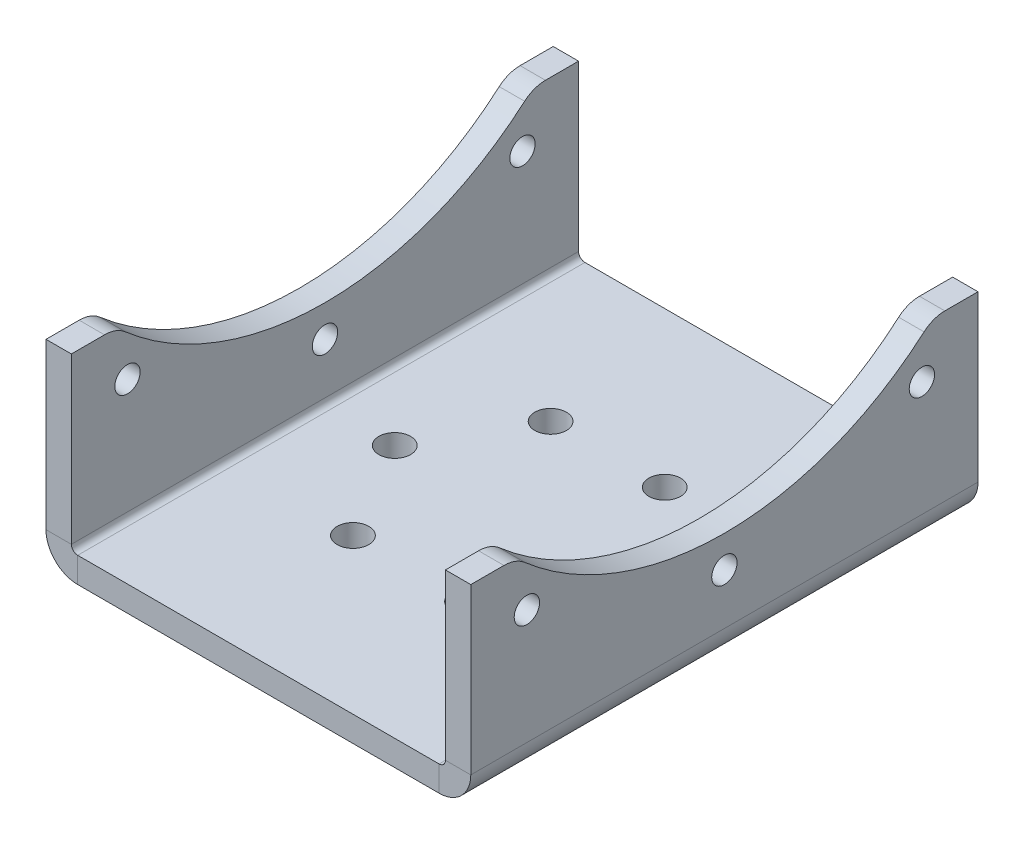
ISO-10303-21;
HEADER;
FILE_DESCRIPTION(('STEP AP214'),'2;1');
FILE_NAME('part.step','',(''),(''),'','','');
FILE_SCHEMA(('AUTOMOTIVE_DESIGN { 1 0 10303 214 1 1 1 1 }'));
ENDSEC;
DATA;
#1=APPLICATION_CONTEXT('core data for automotive mechanical design processes');
#2=APPLICATION_PROTOCOL_DEFINITION('international standard','automotive_design',2000,#1);
#3=PRODUCT_CONTEXT('',#1,'mechanical');
#4=PRODUCT('Part','Part','',(#3));
#5=PRODUCT_RELATED_PRODUCT_CATEGORY('part','',(#4));
#6=PRODUCT_DEFINITION_FORMATION('','',#4);
#7=PRODUCT_DEFINITION_CONTEXT('part definition',#1,'design');
#8=PRODUCT_DEFINITION('design','',#6,#7);
#9=PRODUCT_DEFINITION_SHAPE('','',#8);
#10=(LENGTH_UNIT() NAMED_UNIT(*) SI_UNIT(.MILLI.,.METRE.));
#11=(NAMED_UNIT(*) PLANE_ANGLE_UNIT() SI_UNIT($,.RADIAN.));
#12=(NAMED_UNIT(*) SI_UNIT($,.STERADIAN.) SOLID_ANGLE_UNIT());
#13=UNCERTAINTY_MEASURE_WITH_UNIT(LENGTH_MEASURE(1.E-05),#10,'distance_accuracy_value','');
#14=(GEOMETRIC_REPRESENTATION_CONTEXT(3) GLOBAL_UNCERTAINTY_ASSIGNED_CONTEXT((#13)) GLOBAL_UNIT_ASSIGNED_CONTEXT((#10,
#11,#12)) REPRESENTATION_CONTEXT('',''));
#15=CARTESIAN_POINT('',(0.,0.,0.));
#16=DIRECTION('',(0.,0.,1.));
#17=DIRECTION('',(1.,0.,0.));
#18=AXIS2_PLACEMENT_3D('',#15,#16,#17);
#19=CARTESIAN_POINT('',(-33.5,27.,80.));
#20=DIRECTION('',(0.,1.,0.));
#21=DIRECTION('',(0.,0.,1.));
#22=AXIS2_PLACEMENT_3D('',#19,#20,#21);
#23=PLANE('',#22);
#24=DIRECTION('',(0.,0.,-1.));
#25=VECTOR('',#24,1.);
#26=CARTESIAN_POINT('',(-33.5,27.,80.));
#27=LINE('',#26,#25);
#28=CARTESIAN_POINT('',(-33.5,27.,5.22932269857251));
#29=VERTEX_POINT('',#28);
#30=CARTESIAN_POINT('',(-33.5,27.,0.));
#31=VERTEX_POINT('',#30);
#32=EDGE_CURVE('E298',#29,#31,#27,.T.);
#33=ORIENTED_EDGE('',*,*,#32,.F.);
#34=DIRECTION('',(1.,0.,0.));
#35=VECTOR('',#34,1.);
#36=CARTESIAN_POINT('',(-29.5,27.,5.22932269857251));
#37=LINE('',#36,#35);
#38=CARTESIAN_POINT('',(-29.5,27.,5.22932269857251));
#39=VERTEX_POINT('',#38);
#40=EDGE_CURVE('E344',#29,#39,#37,.T.);
#41=ORIENTED_EDGE('',*,*,#40,.T.);
#42=DIRECTION('',(0.,0.,-1.));
#43=VECTOR('',#42,1.);
#44=CARTESIAN_POINT('',(-29.5,27.,80.));
#45=LINE('',#44,#43);
#46=CARTESIAN_POINT('',(-29.5,27.,0.));
#47=VERTEX_POINT('',#46);
#48=EDGE_CURVE('E196',#39,#47,#45,.T.);
#49=ORIENTED_EDGE('',*,*,#48,.T.);
#50=DIRECTION('',(1.,0.,0.));
#51=VECTOR('',#50,1.);
#52=CARTESIAN_POINT('',(-33.5,27.,0.));
#53=LINE('',#52,#51);
#54=EDGE_CURVE('E236',#31,#47,#53,.T.);
#55=ORIENTED_EDGE('',*,*,#54,.F.);
#56=EDGE_LOOP('',(#33,#41,#49,#55));
#57=FACE_BOUND('',#56,.T.);
#58=ADVANCED_FACE('F36',(#57),#23,.T.);
#59=CARTESIAN_POINT('',(29.5,27.,80.));
#60=DIRECTION('',(0.,1.,0.));
#61=DIRECTION('',(0.,0.,1.));
#62=AXIS2_PLACEMENT_3D('',#59,#60,#61);
#63=PLANE('',#62);
#64=DIRECTION('',(0.,0.,-1.));
#65=VECTOR('',#64,1.);
#66=CARTESIAN_POINT('',(29.5,27.,80.));
#67=LINE('',#66,#65);
#68=CARTESIAN_POINT('',(29.5,27.,5.22932269857251));
#69=VERTEX_POINT('',#68);
#70=CARTESIAN_POINT('',(29.5,27.,0.));
#71=VERTEX_POINT('',#70);
#72=EDGE_CURVE('E279',#69,#71,#67,.T.);
#73=ORIENTED_EDGE('',*,*,#72,.F.);
#74=DIRECTION('',(1.,0.,0.));
#75=VECTOR('',#74,1.);
#76=CARTESIAN_POINT('',(33.5,27.,5.22932269857251));
#77=LINE('',#76,#75);
#78=CARTESIAN_POINT('',(33.5,27.,5.22932269857251));
#79=VERTEX_POINT('',#78);
#80=EDGE_CURVE('E61',#69,#79,#77,.T.);
#81=ORIENTED_EDGE('',*,*,#80,.T.);
#82=DIRECTION('',(0.,0.,-1.));
#83=VECTOR('',#82,1.);
#84=CARTESIAN_POINT('',(33.5,27.,80.));
#85=LINE('',#84,#83);
#86=CARTESIAN_POINT('',(33.5,27.,0.));
#87=VERTEX_POINT('',#86);
#88=EDGE_CURVE('E283',#79,#87,#85,.T.);
#89=ORIENTED_EDGE('',*,*,#88,.T.);
#90=DIRECTION('',(1.,0.,0.));
#91=VECTOR('',#90,1.);
#92=CARTESIAN_POINT('',(29.5,27.,0.));
#93=LINE('',#92,#91);
#94=EDGE_CURVE('E255',#71,#87,#93,.T.);
#95=ORIENTED_EDGE('',*,*,#94,.F.);
#96=EDGE_LOOP('',(#73,#81,#89,#95));
#97=FACE_BOUND('',#96,.T.);
#98=ADVANCED_FACE('F426',(#97),#63,.T.);
#99=CARTESIAN_POINT('',(29.5,1.00000000000001,80.));
#100=DIRECTION('',(0.,0.,1.));
#101=DIRECTION('',(1.,0.,0.));
#102=AXIS2_PLACEMENT_3D('',#99,#100,#101);
#103=PLANE('',#102);
#104=DIRECTION('',(1.,0.,0.));
#105=VECTOR('',#104,1.);
#106=CARTESIAN_POINT('',(29.5,1.00000000000001,80.));
#107=LINE('',#106,#105);
#108=CARTESIAN_POINT('',(29.5,1.00000000000001,80.));
#109=VERTEX_POINT('',#108);
#110=CARTESIAN_POINT('',(33.5,1.00000000000001,80.));
#111=VERTEX_POINT('',#110);
#112=EDGE_CURVE('E312',#109,#111,#107,.T.);
#113=ORIENTED_EDGE('',*,*,#112,.F.);
#114=CARTESIAN_POINT('',(28.5,1.00000000000001,80.));
#115=DIRECTION('',(0.,0.,1.));
#116=DIRECTION('',(1.,0.,0.));
#117=AXIS2_PLACEMENT_3D('',#114,#115,#116);
#118=CIRCLE('',#117,1.);
#119=CARTESIAN_POINT('',(28.5,0.,80.));
#120=VERTEX_POINT('',#119);
#121=EDGE_CURVE('E224',#109,#120,#118,.F.);
#122=ORIENTED_EDGE('',*,*,#121,.T.);
#123=DIRECTION('',(0.,1.,0.));
#124=VECTOR('',#123,1.);
#125=CARTESIAN_POINT('',(28.5,-3.99999999999999,80.));
#126=LINE('',#125,#124);
#127=CARTESIAN_POINT('',(28.5,-3.99999999999999,80.));
#128=VERTEX_POINT('',#127);
#129=EDGE_CURVE('E310',#128,#120,#126,.T.);
#130=ORIENTED_EDGE('',*,*,#129,.F.);
#131=CARTESIAN_POINT('',(28.5,1.00000000000001,80.));
#132=DIRECTION('',(0.,0.,1.));
#133=DIRECTION('',(1.,0.,0.));
#134=AXIS2_PLACEMENT_3D('',#131,#132,#133);
#135=CIRCLE('',#134,5.);
#136=EDGE_CURVE('E212',#111,#128,#135,.F.);
#137=ORIENTED_EDGE('',*,*,#136,.F.);
#138=EDGE_LOOP('',(#113,#122,#130,#137));
#139=FACE_BOUND('',#138,.T.);
#140=ADVANCED_FACE('F432',(#139),#103,.T.);
#141=CARTESIAN_POINT('',(28.5,-3.99999999999999,80.));
#142=DIRECTION('',(0.,0.,1.));
#143=DIRECTION('',(1.,0.,0.));
#144=AXIS2_PLACEMENT_3D('',#141,#142,#143);
#145=PLANE('',#144);
#146=DIRECTION('',(0.,-1.,0.));
#147=VECTOR('',#146,1.);
#148=CARTESIAN_POINT('',(29.5,0.,80.));
#149=LINE('',#148,#147);
#150=CARTESIAN_POINT('',(29.5,27.,80.));
#151=VERTEX_POINT('',#150);
#152=EDGE_CURVE('E221',#151,#109,#149,.T.);
#153=ORIENTED_EDGE('',*,*,#152,.T.);
#154=ORIENTED_EDGE('',*,*,#112,.T.);
#155=DIRECTION('',(0.,1.,0.));
#156=VECTOR('',#155,1.);
#157=CARTESIAN_POINT('',(33.5,0.,80.));
#158=LINE('',#157,#156);
#159=CARTESIAN_POINT('',(33.5,27.,80.));
#160=VERTEX_POINT('',#159);
#161=EDGE_CURVE('E215',#160,#111,#158,.F.);
#162=ORIENTED_EDGE('',*,*,#161,.F.);
#163=DIRECTION('',(1.,0.,0.));
#164=VECTOR('',#163,1.);
#165=CARTESIAN_POINT('',(29.5,27.,80.));
#166=LINE('',#165,#164);
#167=EDGE_CURVE('E218',#151,#160,#166,.T.);
#168=ORIENTED_EDGE('',*,*,#167,.F.);
#169=EDGE_LOOP('',(#153,#154,#162,#168));
#170=FACE_BOUND('',#169,.T.);
#171=ADVANCED_FACE('F472',(#170),#145,.T.);
#172=CARTESIAN_POINT('',(28.5,0.,0.));
#173=DIRECTION('',(0.,0.,-1.));
#174=DIRECTION('',(-1.,0.,0.));
#175=AXIS2_PLACEMENT_3D('',#172,#173,#174);
#176=PLANE('',#175);
#177=DIRECTION('',(0.,-1.,0.));
#178=VECTOR('',#177,1.);
#179=CARTESIAN_POINT('',(28.5,0.,0.));
#180=LINE('',#179,#178);
#181=CARTESIAN_POINT('',(28.5,0.,0.));
#182=VERTEX_POINT('',#181);
#183=CARTESIAN_POINT('',(28.5,-3.99999999999999,0.));
#184=VERTEX_POINT('',#183);
#185=EDGE_CURVE('E308',#182,#184,#180,.T.);
#186=ORIENTED_EDGE('',*,*,#185,.F.);
#187=CARTESIAN_POINT('',(28.5,1.00000000000001,0.));
#188=DIRECTION('',(0.,0.,1.));
#189=DIRECTION('',(1.,0.,0.));
#190=AXIS2_PLACEMENT_3D('',#187,#188,#189);
#191=CIRCLE('',#190,1.);
#192=CARTESIAN_POINT('',(29.5,1.00000000000001,0.));
#193=VERTEX_POINT('',#192);
#194=EDGE_CURVE('E261',#193,#182,#191,.F.);
#195=ORIENTED_EDGE('',*,*,#194,.F.);
#196=DIRECTION('',(-1.,0.,0.));
#197=VECTOR('',#196,1.);
#198=CARTESIAN_POINT('',(33.5,1.00000000000001,0.));
#199=LINE('',#198,#197);
#200=CARTESIAN_POINT('',(33.5,1.00000000000001,0.));
#201=VERTEX_POINT('',#200);
#202=EDGE_CURVE('E306',#201,#193,#199,.T.);
#203=ORIENTED_EDGE('',*,*,#202,.F.);
#204=CARTESIAN_POINT('',(28.5,1.00000000000001,0.));
#205=DIRECTION('',(0.,0.,1.));
#206=DIRECTION('',(1.,0.,0.));
#207=AXIS2_PLACEMENT_3D('',#204,#205,#206);
#208=CIRCLE('',#207,5.);
#209=EDGE_CURVE('E249',#201,#184,#208,.F.);
#210=ORIENTED_EDGE('',*,*,#209,.T.);
#211=EDGE_LOOP('',(#186,#195,#203,#210));
#212=FACE_BOUND('',#211,.T.);
#213=ADVANCED_FACE('F468',(#212),#176,.T.);
#214=CARTESIAN_POINT('',(33.5,1.00000000000001,0.));
#215=DIRECTION('',(0.,0.,-1.));
#216=DIRECTION('',(-1.,0.,0.));
#217=AXIS2_PLACEMENT_3D('',#214,#215,#216);
#218=PLANE('',#217);
#219=DIRECTION('',(-1.,0.,0.));
#220=VECTOR('',#219,1.);
#221=CARTESIAN_POINT('',(-29.5,0.,0.));
#222=LINE('',#221,#220);
#223=CARTESIAN_POINT('',(-28.5,0.,0.));
#224=VERTEX_POINT('',#223);
#225=EDGE_CURVE('E264',#182,#224,#222,.T.);
#226=ORIENTED_EDGE('',*,*,#225,.F.);
#227=ORIENTED_EDGE('',*,*,#185,.T.);
#228=DIRECTION('',(-1.,0.,0.));
#229=VECTOR('',#228,1.);
#230=CARTESIAN_POINT('',(-29.5,-4.,0.));
#231=LINE('',#230,#229);
#232=CARTESIAN_POINT('',(-28.5,-4.,0.));
#233=VERTEX_POINT('',#232);
#234=EDGE_CURVE('E246',#184,#233,#231,.T.);
#235=ORIENTED_EDGE('',*,*,#234,.T.);
#236=DIRECTION('',(0.,1.,0.));
#237=VECTOR('',#236,1.);
#238=CARTESIAN_POINT('',(-28.5,-4.,0.));
#239=LINE('',#238,#237);
#240=EDGE_CURVE('E195',#233,#224,#239,.T.);
#241=ORIENTED_EDGE('',*,*,#240,.T.);
#242=EDGE_LOOP('',(#226,#227,#235,#241));
#243=FACE_BOUND('',#242,.T.);
#244=ADVANCED_FACE('F464',(#243),#218,.T.);
#245=CARTESIAN_POINT('',(-28.5,0.,80.));
#246=DIRECTION('',(0.,0.,1.));
#247=DIRECTION('',(1.,0.,0.));
#248=AXIS2_PLACEMENT_3D('',#245,#246,#247);
#249=PLANE('',#248);
#250=DIRECTION('',(0.,-1.,0.));
#251=VECTOR('',#250,1.);
#252=CARTESIAN_POINT('',(-28.5,0.,80.));
#253=LINE('',#252,#251);
#254=CARTESIAN_POINT('',(-28.5,0.,80.));
#255=VERTEX_POINT('',#254);
#256=CARTESIAN_POINT('',(-28.5,-4.,80.));
#257=VERTEX_POINT('',#256);
#258=EDGE_CURVE('E304',#255,#257,#253,.T.);
#259=ORIENTED_EDGE('',*,*,#258,.F.);
#260=CARTESIAN_POINT('',(-28.5,1.,80.));
#261=DIRECTION('',(0.,0.,1.));
#262=DIRECTION('',(1.,0.,0.));
#263=AXIS2_PLACEMENT_3D('',#260,#261,#262);
#264=CIRCLE('',#263,1.);
#265=CARTESIAN_POINT('',(-29.5,1.,80.));
#266=VERTEX_POINT('',#265);
#267=EDGE_CURVE('E230',#255,#266,#264,.F.);
#268=ORIENTED_EDGE('',*,*,#267,.T.);
#269=DIRECTION('',(1.,0.,0.));
#270=VECTOR('',#269,1.);
#271=CARTESIAN_POINT('',(-33.5,1.,80.));
#272=LINE('',#271,#270);
#273=CARTESIAN_POINT('',(-33.5,1.,80.));
#274=VERTEX_POINT('',#273);
#275=EDGE_CURVE('E182',#274,#266,#272,.T.);
#276=ORIENTED_EDGE('',*,*,#275,.F.);
#277=CARTESIAN_POINT('',(-28.5,1.,80.));
#278=DIRECTION('',(0.,0.,1.));
#279=DIRECTION('',(1.,0.,0.));
#280=AXIS2_PLACEMENT_3D('',#277,#278,#279);
#281=CIRCLE('',#280,5.);
#282=EDGE_CURVE('E203',#257,#274,#281,.F.);
#283=ORIENTED_EDGE('',*,*,#282,.F.);
#284=EDGE_LOOP('',(#259,#268,#276,#283));
#285=FACE_BOUND('',#284,.T.);
#286=ADVANCED_FACE('F460',(#285),#249,.T.);
#287=CARTESIAN_POINT('',(-33.5,1.,80.));
#288=DIRECTION('',(0.,0.,1.));
#289=DIRECTION('',(1.,0.,0.));
#290=AXIS2_PLACEMENT_3D('',#287,#288,#289);
#291=PLANE('',#290);
#292=DIRECTION('',(-1.,0.,0.));
#293=VECTOR('',#292,1.);
#294=CARTESIAN_POINT('',(-29.5,0.,80.));
#295=LINE('',#294,#293);
#296=EDGE_CURVE('E227',#120,#255,#295,.T.);
#297=ORIENTED_EDGE('',*,*,#296,.T.);
#298=ORIENTED_EDGE('',*,*,#258,.T.);
#299=DIRECTION('',(-1.,0.,0.));
#300=VECTOR('',#299,1.);
#301=CARTESIAN_POINT('',(-29.5,-4.,80.));
#302=LINE('',#301,#300);
#303=EDGE_CURVE('E209',#128,#257,#302,.T.);
#304=ORIENTED_EDGE('',*,*,#303,.F.);
#305=ORIENTED_EDGE('',*,*,#129,.T.);
#306=EDGE_LOOP('',(#297,#298,#304,#305));
#307=FACE_BOUND('',#306,.T.);
#308=ADVANCED_FACE('F456',(#307),#291,.T.);
#309=CARTESIAN_POINT('',(-29.5,1.,0.));
#310=DIRECTION('',(0.,0.,-1.));
#311=DIRECTION('',(-1.,0.,0.));
#312=AXIS2_PLACEMENT_3D('',#309,#310,#311);
#313=PLANE('',#312);
#314=DIRECTION('',(-1.,0.,0.));
#315=VECTOR('',#314,1.);
#316=CARTESIAN_POINT('',(-29.5,1.,0.));
#317=LINE('',#316,#315);
#318=CARTESIAN_POINT('',(-29.5,1.,0.));
#319=VERTEX_POINT('',#318);
#320=CARTESIAN_POINT('',(-33.5,1.,0.));
#321=VERTEX_POINT('',#320);
#322=EDGE_CURVE('E301',#319,#321,#317,.T.);
#323=ORIENTED_EDGE('',*,*,#322,.F.);
#324=CARTESIAN_POINT('',(-28.5,1.,0.));
#325=DIRECTION('',(0.,0.,1.));
#326=DIRECTION('',(1.,0.,0.));
#327=AXIS2_PLACEMENT_3D('',#324,#325,#326);
#328=CIRCLE('',#327,1.);
#329=EDGE_CURVE('E186',#224,#319,#328,.F.);
#330=ORIENTED_EDGE('',*,*,#329,.F.);
#331=ORIENTED_EDGE('',*,*,#240,.F.);
#332=CARTESIAN_POINT('',(-28.5,1.,0.));
#333=DIRECTION('',(0.,0.,1.));
#334=DIRECTION('',(1.,0.,0.));
#335=AXIS2_PLACEMENT_3D('',#332,#333,#334);
#336=CIRCLE('',#335,5.);
#337=EDGE_CURVE('E243',#233,#321,#336,.F.);
#338=ORIENTED_EDGE('',*,*,#337,.T.);
#339=EDGE_LOOP('',(#323,#330,#331,#338));
#340=FACE_BOUND('',#339,.T.);
#341=ADVANCED_FACE('F450',(#340),#313,.T.);
#342=CARTESIAN_POINT('',(-28.5,-4.,0.));
#343=DIRECTION('',(0.,0.,-1.));
#344=DIRECTION('',(-1.,0.,0.));
#345=AXIS2_PLACEMENT_3D('',#342,#343,#344);
#346=PLANE('',#345);
#347=DIRECTION('',(0.,1.,0.));
#348=VECTOR('',#347,1.);
#349=CARTESIAN_POINT('',(-29.5,0.,0.));
#350=LINE('',#349,#348);
#351=EDGE_CURVE('E233',#319,#47,#350,.T.);
#352=ORIENTED_EDGE('',*,*,#351,.F.);
#353=ORIENTED_EDGE('',*,*,#322,.T.);
#354=DIRECTION('',(0.,1.,0.));
#355=VECTOR('',#354,1.);
#356=CARTESIAN_POINT('',(-33.5,0.,0.));
#357=LINE('',#356,#355);
#358=EDGE_CURVE('E240',#321,#31,#357,.T.);
#359=ORIENTED_EDGE('',*,*,#358,.T.);
#360=ORIENTED_EDGE('',*,*,#54,.T.);
#361=EDGE_LOOP('',(#352,#353,#359,#360));
#362=FACE_BOUND('',#361,.T.);
#363=ADVANCED_FACE('F446',(#362),#346,.T.);
#364=CARTESIAN_POINT('',(-29.5,0.,80.));
#365=DIRECTION('',(-1.,0.,0.));
#366=DIRECTION('',(0.,0.,1.));
#367=AXIS2_PLACEMENT_3D('',#364,#365,#366);
#368=PLANE('',#367);
#369=CARTESIAN_POINT('',(-29.5,19.1220992981278,71.1526183715011));
#370=DIRECTION('',(-1.,0.,0.));
#371=DIRECTION('',(0.,0.,1.));
#372=AXIS2_PLACEMENT_3D('',#369,#370,#371);
#373=CIRCLE('',#372,2.);
#374=CARTESIAN_POINT('',(-29.5,19.1220992981278,73.1526183715011));
#375=VERTEX_POINT('',#374);
#376=EDGE_CURVE('E237',#375,#375,#373,.T.);
#377=ORIENTED_EDGE('',*,*,#376,.T.);
#378=EDGE_LOOP('',(#377));
#379=FACE_BOUND('',#378,.T.);
#380=CARTESIAN_POINT('',(-29.5,19.1220992981278,8.84738162849894));
#381=DIRECTION('',(-1.,0.,0.));
#382=DIRECTION('',(0.,0.,1.));
#383=AXIS2_PLACEMENT_3D('',#380,#381,#382);
#384=CIRCLE('',#383,2.00000000000001);
#385=CARTESIAN_POINT('',(-29.5,19.1220992981278,10.847381628499));
#386=VERTEX_POINT('',#385);
#387=EDGE_CURVE('E326',#386,#386,#384,.T.);
#388=ORIENTED_EDGE('',*,*,#387,.T.);
#389=EDGE_LOOP('',(#388));
#390=FACE_BOUND('',#389,.T.);
#391=CARTESIAN_POINT('',(-29.5,8.99999999999999,40.));
#392=DIRECTION('',(-1.,0.,0.));
#393=DIRECTION('',(0.,0.,1.));
#394=AXIS2_PLACEMENT_3D('',#391,#392,#393);
#395=CIRCLE('',#394,1.99999999999998);
#396=CARTESIAN_POINT('',(-29.5,8.99999999999999,42.));
#397=VERTEX_POINT('',#396);
#398=EDGE_CURVE('E321',#397,#397,#395,.T.);
#399=ORIENTED_EDGE('',*,*,#398,.T.);
#400=EDGE_LOOP('',(#399));
#401=FACE_BOUND('',#400,.T.);
#402=CARTESIAN_POINT('',(-29.5,62.,40.));
#403=DIRECTION('',(-1.,0.,0.));
#404=DIRECTION('',(0.,0.,1.));
#405=AXIS2_PLACEMENT_3D('',#402,#403,#404);
#406=CIRCLE('',#405,48.);
#407=CARTESIAN_POINT('',(-29.5,25.7735849056604,8.50957527417888));
#408=VERTEX_POINT('',#407);
#409=CARTESIAN_POINT('',(-29.5,25.7735849056604,71.4904247258211));
#410=VERTEX_POINT('',#409);
#411=EDGE_CURVE('E322',#408,#410,#406,.T.);
#412=ORIENTED_EDGE('',*,*,#411,.T.);
#413=CARTESIAN_POINT('',(-29.5,22.,74.7706773014275));
#414=DIRECTION('',(-1.,0.,0.));
#415=DIRECTION('',(0.,0.,1.));
#416=AXIS2_PLACEMENT_3D('',#413,#414,#415);
#417=CIRCLE('',#416,5.);
#418=CARTESIAN_POINT('',(-29.5,27.,74.7706773014275));
#419=VERTEX_POINT('',#418);
#420=EDGE_CURVE('E192',#410,#419,#417,.F.);
#421=ORIENTED_EDGE('',*,*,#420,.T.);
#422=CARTESIAN_POINT('',(-29.5,27.,80.));
#423=VERTEX_POINT('',#422);
#424=EDGE_CURVE('E189',#423,#419,#45,.T.);
#425=ORIENTED_EDGE('',*,*,#424,.F.);
#426=DIRECTION('',(0.,1.,0.));
#427=VECTOR('',#426,1.);
#428=CARTESIAN_POINT('',(-29.5,0.,80.));
#429=LINE('',#428,#427);
#430=EDGE_CURVE('E175',#266,#423,#429,.T.);
#431=ORIENTED_EDGE('',*,*,#430,.F.);
#432=DIRECTION('',(0.,0.,-1.));
#433=VECTOR('',#432,1.);
#434=CARTESIAN_POINT('',(-29.5,1.,80.));
#435=LINE('',#434,#433);
#436=EDGE_CURVE('E232',#266,#319,#435,.T.);
#437=ORIENTED_EDGE('',*,*,#436,.T.);
#438=ORIENTED_EDGE('',*,*,#351,.T.);
#439=ORIENTED_EDGE('',*,*,#48,.F.);
#440=CARTESIAN_POINT('',(-29.5,22.,5.22932269857251));
#441=DIRECTION('',(-1.,0.,0.));
#442=DIRECTION('',(0.,0.,1.));
#443=AXIS2_PLACEMENT_3D('',#440,#441,#442);
#444=CIRCLE('',#443,5.);
#445=EDGE_CURVE('E335',#39,#408,#444,.F.);
#446=ORIENTED_EDGE('',*,*,#445,.T.);
#447=EDGE_LOOP('',(#412,#421,#425,#431,#437,#438,#439,#446));
#448=FACE_BOUND('',#447,.T.);
#449=ADVANCED_FACE('F191',(#379,#390,#401,#448),#368,.F.);
#450=ORIENTED_EDGE('',*,*,#424,.T.);
#451=DIRECTION('',(1.,0.,0.));
#452=VECTOR('',#451,1.);
#453=CARTESIAN_POINT('',(-33.5,27.,74.7706773014275));
#454=LINE('',#453,#452);
#455=CARTESIAN_POINT('',(-33.5,27.,74.7706773014275));
#456=VERTEX_POINT('',#455);
#457=EDGE_CURVE('E338',#419,#456,#454,.F.);
#458=ORIENTED_EDGE('',*,*,#457,.T.);
#459=CARTESIAN_POINT('',(-33.5,27.,80.));
#460=VERTEX_POINT('',#459);
#461=EDGE_CURVE('E200',#460,#456,#27,.T.);
#462=ORIENTED_EDGE('',*,*,#461,.F.);
#463=DIRECTION('',(1.,0.,0.));
#464=VECTOR('',#463,1.);
#465=CARTESIAN_POINT('',(-33.5,27.,80.));
#466=LINE('',#465,#464);
#467=EDGE_CURVE('E180',#460,#423,#466,.T.);
#468=ORIENTED_EDGE('',*,*,#467,.T.);
#469=EDGE_LOOP('',(#450,#458,#462,#468));
#470=FACE_BOUND('',#469,.T.);
#471=ADVANCED_FACE('F198',(#470),#23,.T.);
#472=CARTESIAN_POINT('',(-33.5,0.,80.));
#473=DIRECTION('',(-1.,0.,0.));
#474=DIRECTION('',(0.,0.,1.));
#475=AXIS2_PLACEMENT_3D('',#472,#473,#474);
#476=PLANE('',#475);
#477=CARTESIAN_POINT('',(-33.5,19.1220992981278,71.1526183715011));
#478=DIRECTION('',(-1.,0.,0.));
#479=DIRECTION('',(0.,0.,1.));
#480=AXIS2_PLACEMENT_3D('',#477,#478,#479);
#481=CIRCLE('',#480,2.);
#482=CARTESIAN_POINT('',(-33.5,19.1220992981278,73.1526183715011));
#483=VERTEX_POINT('',#482);
#484=EDGE_CURVE('E376',#483,#483,#481,.T.);
#485=ORIENTED_EDGE('',*,*,#484,.F.);
#486=EDGE_LOOP('',(#485));
#487=FACE_BOUND('',#486,.T.);
#488=CARTESIAN_POINT('',(-33.5,19.1220992981278,8.84738162849894));
#489=DIRECTION('',(-1.,0.,0.));
#490=DIRECTION('',(0.,0.,1.));
#491=AXIS2_PLACEMENT_3D('',#488,#489,#490);
#492=CIRCLE('',#491,2.00000000000001);
#493=CARTESIAN_POINT('',(-33.5,19.1220992981278,10.847381628499));
#494=VERTEX_POINT('',#493);
#495=EDGE_CURVE('E385',#494,#494,#492,.T.);
#496=ORIENTED_EDGE('',*,*,#495,.F.);
#497=EDGE_LOOP('',(#496));
#498=FACE_BOUND('',#497,.T.);
#499=CARTESIAN_POINT('',(-33.5,8.99999999999999,40.));
#500=DIRECTION('',(-1.,0.,0.));
#501=DIRECTION('',(0.,0.,1.));
#502=AXIS2_PLACEMENT_3D('',#499,#500,#501);
#503=CIRCLE('',#502,1.99999999999998);
#504=CARTESIAN_POINT('',(-33.5,8.99999999999999,42.));
#505=VERTEX_POINT('',#504);
#506=EDGE_CURVE('E950',#505,#505,#503,.T.);
#507=ORIENTED_EDGE('',*,*,#506,.F.);
#508=EDGE_LOOP('',(#507));
#509=FACE_BOUND('',#508,.T.);
#510=ORIENTED_EDGE('',*,*,#461,.T.);
#511=CARTESIAN_POINT('',(-33.5,22.,74.7706773014275));
#512=DIRECTION('',(-1.,0.,0.));
#513=DIRECTION('',(0.,0.,1.));
#514=AXIS2_PLACEMENT_3D('',#511,#512,#513);
#515=CIRCLE('',#514,5.);
#516=CARTESIAN_POINT('',(-33.5,25.7735849056604,71.4904247258211));
#517=VERTEX_POINT('',#516);
#518=EDGE_CURVE('E342',#456,#517,#515,.T.);
#519=ORIENTED_EDGE('',*,*,#518,.T.);
#520=CARTESIAN_POINT('',(-33.5,62.,40.));
#521=DIRECTION('',(-1.,0.,0.));
#522=DIRECTION('',(0.,0.,1.));
#523=AXIS2_PLACEMENT_3D('',#520,#521,#522);
#524=CIRCLE('',#523,48.);
#525=CARTESIAN_POINT('',(-33.5,25.7735849056604,8.50957527417888));
#526=VERTEX_POINT('',#525);
#527=EDGE_CURVE('E391',#526,#517,#524,.T.);
#528=ORIENTED_EDGE('',*,*,#527,.F.);
#529=CARTESIAN_POINT('',(-33.5,22.,5.22932269857251));
#530=DIRECTION('',(-1.,0.,0.));
#531=DIRECTION('',(0.,0.,1.));
#532=AXIS2_PLACEMENT_3D('',#529,#530,#531);
#533=CIRCLE('',#532,5.);
#534=EDGE_CURVE('E340',#526,#29,#533,.T.);
#535=ORIENTED_EDGE('',*,*,#534,.T.);
#536=ORIENTED_EDGE('',*,*,#32,.T.);
#537=ORIENTED_EDGE('',*,*,#358,.F.);
#538=DIRECTION('',(0.,0.,-1.));
#539=VECTOR('',#538,1.);
#540=CARTESIAN_POINT('',(-33.5,1.,80.));
#541=LINE('',#540,#539);
#542=EDGE_CURVE('E295',#274,#321,#541,.T.);
#543=ORIENTED_EDGE('',*,*,#542,.F.);
#544=DIRECTION('',(0.,1.,0.));
#545=VECTOR('',#544,1.);
#546=CARTESIAN_POINT('',(-33.5,0.,80.));
#547=LINE('',#546,#545);
#548=EDGE_CURVE('E201',#274,#460,#547,.T.);
#549=ORIENTED_EDGE('',*,*,#548,.T.);
#550=EDGE_LOOP('',(#510,#519,#528,#535,#536,#537,#543,#549));
#551=FACE_BOUND('',#550,.T.);
#552=ADVANCED_FACE('F439',(#487,#498,#509,#551),#476,.T.);
#553=CARTESIAN_POINT('',(-28.5,1.,80.));
#554=DIRECTION('',(0.,0.,-1.));
#555=DIRECTION('',(-1.,0.,0.));
#556=AXIS2_PLACEMENT_3D('',#553,#554,#555);
#557=CYLINDRICAL_SURFACE('',#556,5.);
#558=ORIENTED_EDGE('',*,*,#337,.F.);
#559=DIRECTION('',(0.,0.,-1.));
#560=VECTOR('',#559,1.);
#561=CARTESIAN_POINT('',(-28.5,-4.,80.));
#562=LINE('',#561,#560);
#563=EDGE_CURVE('E292',#257,#233,#562,.T.);
#564=ORIENTED_EDGE('',*,*,#563,.F.);
#565=ORIENTED_EDGE('',*,*,#282,.T.);
#566=ORIENTED_EDGE('',*,*,#542,.T.);
#567=EDGE_LOOP('',(#558,#564,#565,#566));
#568=FACE_BOUND('',#567,.T.);
#569=ADVANCED_FACE('F444',(#568),#557,.T.);
#570=CARTESIAN_POINT('',(-29.5,-4.,80.));
#571=DIRECTION('',(0.,-1.,0.));
#572=DIRECTION('',(1.,0.,0.));
#573=AXIS2_PLACEMENT_3D('',#570,#571,#572);
#574=PLANE('',#573);
#575=CARTESIAN_POINT('',(17.5,-3.99999999999999,40.));
#576=DIRECTION('',(0.,-1.,0.));
#577=DIRECTION('',(1.,0.,0.));
#578=AXIS2_PLACEMENT_3D('',#575,#576,#577);
#579=CIRCLE('',#578,2.5);
#580=CARTESIAN_POINT('',(20.,-3.99999999999999,40.));
#581=VERTEX_POINT('',#580);
#582=EDGE_CURVE('E363',#581,#581,#579,.T.);
#583=ORIENTED_EDGE('',*,*,#582,.F.);
#584=EDGE_LOOP('',(#583));
#585=FACE_BOUND('',#584,.T.);
#586=CARTESIAN_POINT('',(-9.5,-4.,24.4115427318801));
#587=DIRECTION('',(0.,-1.,0.));
#588=DIRECTION('',(1.,0.,0.));
#589=AXIS2_PLACEMENT_3D('',#586,#587,#588);
#590=CIRCLE('',#589,2.5);
#591=CARTESIAN_POINT('',(-7.,-4.,24.4115427318801));
#592=VERTEX_POINT('',#591);
#593=EDGE_CURVE('E937',#592,#592,#590,.T.);
#594=ORIENTED_EDGE('',*,*,#593,.F.);
#595=EDGE_LOOP('',(#594));
#596=FACE_BOUND('',#595,.T.);
#597=CARTESIAN_POINT('',(8.49999999999999,-3.99999999999999,55.5884572681199));
#598=DIRECTION('',(0.,-1.,0.));
#599=DIRECTION('',(1.,0.,0.));
#600=AXIS2_PLACEMENT_3D('',#597,#598,#599);
#601=CIRCLE('',#600,2.5);
#602=CARTESIAN_POINT('',(11.,-3.99999999999999,55.5884572681199));
#603=VERTEX_POINT('',#602);
#604=EDGE_CURVE('E939',#603,#603,#601,.T.);
#605=ORIENTED_EDGE('',*,*,#604,.F.);
#606=EDGE_LOOP('',(#605));
#607=FACE_BOUND('',#606,.T.);
#608=CARTESIAN_POINT('',(-9.5,-4.,55.5884572681199));
#609=DIRECTION('',(0.,-1.,0.));
#610=DIRECTION('',(1.,0.,0.));
#611=AXIS2_PLACEMENT_3D('',#608,#609,#610);
#612=CIRCLE('',#611,2.5);
#613=CARTESIAN_POINT('',(-7.,-4.,55.5884572681199));
#614=VERTEX_POINT('',#613);
#615=EDGE_CURVE('E943',#614,#614,#612,.T.);
#616=ORIENTED_EDGE('',*,*,#615,.F.);
#617=EDGE_LOOP('',(#616));
#618=FACE_BOUND('',#617,.T.);
#619=CARTESIAN_POINT('',(-18.5,-4.,40.));
#620=DIRECTION('',(0.,-1.,0.));
#621=DIRECTION('',(1.,0.,0.));
#622=AXIS2_PLACEMENT_3D('',#619,#620,#621);
#623=CIRCLE('',#622,2.5);
#624=CARTESIAN_POINT('',(-16.,-4.,40.));
#625=VERTEX_POINT('',#624);
#626=EDGE_CURVE('E934',#625,#625,#623,.T.);
#627=ORIENTED_EDGE('',*,*,#626,.F.);
#628=EDGE_LOOP('',(#627));
#629=FACE_BOUND('',#628,.T.);
#630=CARTESIAN_POINT('',(8.5,-3.99999999999999,24.4115427318801));
#631=DIRECTION('',(0.,-1.,0.));
#632=DIRECTION('',(1.,0.,0.));
#633=AXIS2_PLACEMENT_3D('',#630,#631,#632);
#634=CIRCLE('',#633,2.5);
#635=CARTESIAN_POINT('',(11.,-3.99999999999999,24.4115427318801));
#636=VERTEX_POINT('',#635);
#637=EDGE_CURVE('E931',#636,#636,#634,.T.);
#638=ORIENTED_EDGE('',*,*,#637,.F.);
#639=EDGE_LOOP('',(#638));
#640=FACE_BOUND('',#639,.T.);
#641=ORIENTED_EDGE('',*,*,#234,.F.);
#642=DIRECTION('',(0.,0.,-1.));
#643=VECTOR('',#642,1.);
#644=CARTESIAN_POINT('',(28.5,-3.99999999999999,80.));
#645=LINE('',#644,#643);
#646=EDGE_CURVE('E289',#128,#184,#645,.T.);
#647=ORIENTED_EDGE('',*,*,#646,.F.);
#648=ORIENTED_EDGE('',*,*,#303,.T.);
#649=ORIENTED_EDGE('',*,*,#563,.T.);
#650=EDGE_LOOP('',(#641,#647,#648,#649));
#651=FACE_BOUND('',#650,.T.);
#652=ADVANCED_FACE('F586',(#585,#596,#607,#618,#629,#640,#651),#574,.T.);
#653=CARTESIAN_POINT('',(28.5,1.00000000000001,80.));
#654=DIRECTION('',(0.,0.,-1.));
#655=DIRECTION('',(-1.,0.,0.));
#656=AXIS2_PLACEMENT_3D('',#653,#654,#655);
#657=CYLINDRICAL_SURFACE('',#656,5.);
#658=ORIENTED_EDGE('',*,*,#209,.F.);
#659=DIRECTION('',(0.,0.,-1.));
#660=VECTOR('',#659,1.);
#661=CARTESIAN_POINT('',(33.5,1.00000000000001,80.));
#662=LINE('',#661,#660);
#663=EDGE_CURVE('E286',#111,#201,#662,.T.);
#664=ORIENTED_EDGE('',*,*,#663,.F.);
#665=ORIENTED_EDGE('',*,*,#136,.T.);
#666=ORIENTED_EDGE('',*,*,#646,.T.);
#667=EDGE_LOOP('',(#658,#664,#665,#666));
#668=FACE_BOUND('',#667,.T.);
#669=ADVANCED_FACE('F513',(#668),#657,.T.);
#670=CARTESIAN_POINT('',(33.5,0.,80.));
#671=DIRECTION('',(1.,0.,0.));
#672=DIRECTION('',(0.,0.,-1.));
#673=AXIS2_PLACEMENT_3D('',#670,#671,#672);
#674=PLANE('',#673);
#675=CARTESIAN_POINT('',(33.5,19.1220992981278,71.1526183715011));
#676=DIRECTION('',(-1.,0.,0.));
#677=DIRECTION('',(0.,0.,1.));
#678=AXIS2_PLACEMENT_3D('',#675,#676,#677);
#679=CIRCLE('',#678,2.);
#680=CARTESIAN_POINT('',(33.5,19.1220992981278,73.1526183715011));
#681=VERTEX_POINT('',#680);
#682=EDGE_CURVE('E380',#681,#681,#679,.T.);
#683=ORIENTED_EDGE('',*,*,#682,.T.);
#684=EDGE_LOOP('',(#683));
#685=FACE_BOUND('',#684,.T.);
#686=CARTESIAN_POINT('',(33.5,19.1220992981278,8.84738162849894));
#687=DIRECTION('',(-1.,0.,0.));
#688=DIRECTION('',(0.,0.,1.));
#689=AXIS2_PLACEMENT_3D('',#686,#687,#688);
#690=CIRCLE('',#689,2.00000000000001);
#691=CARTESIAN_POINT('',(33.5,19.1220992981278,10.847381628499));
#692=VERTEX_POINT('',#691);
#693=EDGE_CURVE('E953',#692,#692,#690,.T.);
#694=ORIENTED_EDGE('',*,*,#693,.T.);
#695=EDGE_LOOP('',(#694));
#696=FACE_BOUND('',#695,.T.);
#697=CARTESIAN_POINT('',(33.5,8.99999999999999,40.));
#698=DIRECTION('',(-1.,0.,0.));
#699=DIRECTION('',(0.,0.,1.));
#700=AXIS2_PLACEMENT_3D('',#697,#698,#699);
#701=CIRCLE('',#700,1.99999999999998);
#702=CARTESIAN_POINT('',(33.5,8.99999999999999,42.));
#703=VERTEX_POINT('',#702);
#704=EDGE_CURVE('E394',#703,#703,#701,.T.);
#705=ORIENTED_EDGE('',*,*,#704,.T.);
#706=EDGE_LOOP('',(#705));
#707=FACE_BOUND('',#706,.T.);
#708=ORIENTED_EDGE('',*,*,#88,.F.);
#709=CARTESIAN_POINT('',(33.5,22.,5.22932269857251));
#710=DIRECTION('',(1.,0.,0.));
#711=DIRECTION('',(0.,0.,-1.));
#712=AXIS2_PLACEMENT_3D('',#709,#710,#711);
#713=CIRCLE('',#712,5.);
#714=CARTESIAN_POINT('',(33.5,25.7735849056604,8.50957527417887));
#715=VERTEX_POINT('',#714);
#716=EDGE_CURVE('E45',#79,#715,#713,.T.);
#717=ORIENTED_EDGE('',*,*,#716,.T.);
#718=CARTESIAN_POINT('',(33.5,62.,40.));
#719=DIRECTION('',(-1.,0.,0.));
#720=DIRECTION('',(0.,0.,1.));
#721=AXIS2_PLACEMENT_3D('',#718,#719,#720);
#722=CIRCLE('',#721,48.);
#723=CARTESIAN_POINT('',(33.5,25.7735849056604,71.4904247258212));
#724=VERTEX_POINT('',#723);
#725=EDGE_CURVE('E389',#715,#724,#722,.T.);
#726=ORIENTED_EDGE('',*,*,#725,.T.);
#727=CARTESIAN_POINT('',(33.5,22.,74.7706773014275));
#728=DIRECTION('',(1.,0.,0.));
#729=DIRECTION('',(0.,0.,-1.));
#730=AXIS2_PLACEMENT_3D('',#727,#728,#729);
#731=CIRCLE('',#730,5.);
#732=CARTESIAN_POINT('',(33.5,27.,74.7706773014275));
#733=VERTEX_POINT('',#732);
#734=EDGE_CURVE('E53',#724,#733,#731,.T.);
#735=ORIENTED_EDGE('',*,*,#734,.T.);
#736=EDGE_CURVE('E284',#160,#733,#85,.T.);
#737=ORIENTED_EDGE('',*,*,#736,.F.);
#738=ORIENTED_EDGE('',*,*,#161,.T.);
#739=ORIENTED_EDGE('',*,*,#663,.T.);
#740=DIRECTION('',(0.,1.,0.));
#741=VECTOR('',#740,1.);
#742=CARTESIAN_POINT('',(33.5,0.,0.));
#743=LINE('',#742,#741);
#744=EDGE_CURVE('E252',#87,#201,#743,.F.);
#745=ORIENTED_EDGE('',*,*,#744,.F.);
#746=EDGE_LOOP('',(#708,#717,#726,#735,#737,#738,#739,#745));
#747=FACE_BOUND('',#746,.T.);
#748=ADVANCED_FACE('F493',(#685,#696,#707,#747),#674,.T.);
#749=ORIENTED_EDGE('',*,*,#736,.T.);
#750=DIRECTION('',(1.,0.,0.));
#751=VECTOR('',#750,1.);
#752=CARTESIAN_POINT('',(29.5,27.,74.7706773014275));
#753=LINE('',#752,#751);
#754=CARTESIAN_POINT('',(29.5,27.,74.7706773014275));
#755=VERTEX_POINT('',#754);
#756=EDGE_CURVE('E11',#733,#755,#753,.F.);
#757=ORIENTED_EDGE('',*,*,#756,.T.);
#758=EDGE_CURVE('E280',#151,#755,#67,.T.);
#759=ORIENTED_EDGE('',*,*,#758,.F.);
#760=ORIENTED_EDGE('',*,*,#167,.T.);
#761=EDGE_LOOP('',(#749,#757,#759,#760));
#762=FACE_BOUND('',#761,.T.);
#763=ADVANCED_FACE('F434',(#762),#63,.T.);
#764=CARTESIAN_POINT('',(29.5,0.,80.));
#765=DIRECTION('',(1.,0.,0.));
#766=DIRECTION('',(0.,0.,-1.));
#767=AXIS2_PLACEMENT_3D('',#764,#765,#766);
#768=PLANE('',#767);
#769=CARTESIAN_POINT('',(29.5,19.1220992981278,71.1526183715011));
#770=DIRECTION('',(1.,0.,0.));
#771=DIRECTION('',(0.,0.,-1.));
#772=AXIS2_PLACEMENT_3D('',#769,#770,#771);
#773=CIRCLE('',#772,2.);
#774=CARTESIAN_POINT('',(29.5,19.1220992981278,69.1526183715011));
#775=VERTEX_POINT('',#774);
#776=EDGE_CURVE('E327',#775,#775,#773,.T.);
#777=ORIENTED_EDGE('',*,*,#776,.T.);
#778=EDGE_LOOP('',(#777));
#779=FACE_BOUND('',#778,.T.);
#780=CARTESIAN_POINT('',(29.5,19.1220992981278,8.84738162849894));
#781=DIRECTION('',(1.,0.,0.));
#782=DIRECTION('',(0.,0.,-1.));
#783=AXIS2_PLACEMENT_3D('',#780,#781,#782);
#784=CIRCLE('',#783,2.00000000000001);
#785=CARTESIAN_POINT('',(29.5,19.1220992981278,6.84738162849893));
#786=VERTEX_POINT('',#785);
#787=EDGE_CURVE('E323',#786,#786,#784,.T.);
#788=ORIENTED_EDGE('',*,*,#787,.T.);
#789=EDGE_LOOP('',(#788));
#790=FACE_BOUND('',#789,.T.);
#791=CARTESIAN_POINT('',(29.5,8.99999999999999,40.));
#792=DIRECTION('',(1.,0.,0.));
#793=DIRECTION('',(0.,0.,-1.));
#794=AXIS2_PLACEMENT_3D('',#791,#792,#793);
#795=CIRCLE('',#794,1.99999999999998);
#796=CARTESIAN_POINT('',(29.5,8.99999999999999,38.));
#797=VERTEX_POINT('',#796);
#798=EDGE_CURVE('E318',#797,#797,#795,.T.);
#799=ORIENTED_EDGE('',*,*,#798,.T.);
#800=EDGE_LOOP('',(#799));
#801=FACE_BOUND('',#800,.T.);
#802=CARTESIAN_POINT('',(29.5,62.,40.));
#803=DIRECTION('',(1.,0.,0.));
#804=DIRECTION('',(0.,0.,-1.));
#805=AXIS2_PLACEMENT_3D('',#802,#803,#804);
#806=CIRCLE('',#805,48.);
#807=CARTESIAN_POINT('',(29.5,25.7735849056604,71.4904247258212));
#808=VERTEX_POINT('',#807);
#809=CARTESIAN_POINT('',(29.5,25.7735849056604,8.50957527417887));
#810=VERTEX_POINT('',#809);
#811=EDGE_CURVE('E314',#808,#810,#806,.T.);
#812=ORIENTED_EDGE('',*,*,#811,.T.);
#813=CARTESIAN_POINT('',(29.5,22.,5.22932269857251));
#814=DIRECTION('',(1.,0.,0.));
#815=DIRECTION('',(0.,0.,-1.));
#816=AXIS2_PLACEMENT_3D('',#813,#814,#815);
#817=CIRCLE('',#816,5.);
#818=EDGE_CURVE('E354',#810,#69,#817,.F.);
#819=ORIENTED_EDGE('',*,*,#818,.T.);
#820=ORIENTED_EDGE('',*,*,#72,.T.);
#821=DIRECTION('',(0.,-1.,0.));
#822=VECTOR('',#821,1.);
#823=CARTESIAN_POINT('',(29.5,0.,0.));
#824=LINE('',#823,#822);
#825=EDGE_CURVE('E258',#71,#193,#824,.T.);
#826=ORIENTED_EDGE('',*,*,#825,.T.);
#827=DIRECTION('',(0.,0.,-1.));
#828=VECTOR('',#827,1.);
#829=CARTESIAN_POINT('',(29.5,1.00000000000001,80.));
#830=LINE('',#829,#828);
#831=EDGE_CURVE('E276',#109,#193,#830,.T.);
#832=ORIENTED_EDGE('',*,*,#831,.F.);
#833=ORIENTED_EDGE('',*,*,#152,.F.);
#834=ORIENTED_EDGE('',*,*,#758,.T.);
#835=CARTESIAN_POINT('',(29.5,22.,74.7706773014275));
#836=DIRECTION('',(1.,0.,0.));
#837=DIRECTION('',(0.,0.,-1.));
#838=AXIS2_PLACEMENT_3D('',#835,#836,#837);
#839=CIRCLE('',#838,5.);
#840=EDGE_CURVE('E352',#755,#808,#839,.F.);
#841=ORIENTED_EDGE('',*,*,#840,.T.);
#842=EDGE_LOOP('',(#812,#819,#820,#826,#832,#833,#834,#841));
#843=FACE_BOUND('',#842,.T.);
#844=ADVANCED_FACE('F504',(#779,#790,#801,#843),#768,.F.);
#845=CARTESIAN_POINT('',(28.5,1.00000000000001,80.));
#846=DIRECTION('',(0.,0.,-1.));
#847=DIRECTION('',(-1.,0.,0.));
#848=AXIS2_PLACEMENT_3D('',#845,#846,#847);
#849=CYLINDRICAL_SURFACE('',#848,1.);
#850=ORIENTED_EDGE('',*,*,#194,.T.);
#851=DIRECTION('',(0.,0.,-1.));
#852=VECTOR('',#851,1.);
#853=CARTESIAN_POINT('',(28.5,0.,80.));
#854=LINE('',#853,#852);
#855=EDGE_CURVE('E273',#120,#182,#854,.T.);
#856=ORIENTED_EDGE('',*,*,#855,.F.);
#857=ORIENTED_EDGE('',*,*,#121,.F.);
#858=ORIENTED_EDGE('',*,*,#831,.T.);
#859=EDGE_LOOP('',(#850,#856,#857,#858));
#860=FACE_BOUND('',#859,.T.);
#861=ADVANCED_FACE('F522',(#860),#849,.F.);
#862=CARTESIAN_POINT('',(-29.5,0.,80.));
#863=DIRECTION('',(0.,-1.,0.));
#864=DIRECTION('',(1.,0.,0.));
#865=AXIS2_PLACEMENT_3D('',#862,#863,#864);
#866=PLANE('',#865);
#867=CARTESIAN_POINT('',(17.5,0.,40.));
#868=DIRECTION('',(0.,-1.,0.));
#869=DIRECTION('',(1.,0.,0.));
#870=AXIS2_PLACEMENT_3D('',#867,#868,#869);
#871=CIRCLE('',#870,2.5);
#872=CARTESIAN_POINT('',(20.,0.,40.));
#873=VERTEX_POINT('',#872);
#874=EDGE_CURVE('E40',#873,#873,#871,.T.);
#875=ORIENTED_EDGE('',*,*,#874,.T.);
#876=EDGE_LOOP('',(#875));
#877=FACE_BOUND('',#876,.T.);
#878=CARTESIAN_POINT('',(-9.5,0.,24.4115427318801));
#879=DIRECTION('',(0.,-1.,0.));
#880=DIRECTION('',(1.,0.,0.));
#881=AXIS2_PLACEMENT_3D('',#878,#879,#880);
#882=CIRCLE('',#881,2.5);
#883=CARTESIAN_POINT('',(-7.,0.,24.4115427318801));
#884=VERTEX_POINT('',#883);
#885=EDGE_CURVE('E371',#884,#884,#882,.T.);
#886=ORIENTED_EDGE('',*,*,#885,.T.);
#887=EDGE_LOOP('',(#886));
#888=FACE_BOUND('',#887,.T.);
#889=CARTESIAN_POINT('',(8.49999999999999,0.,55.5884572681199));
#890=DIRECTION('',(0.,-1.,0.));
#891=DIRECTION('',(1.,0.,0.));
#892=AXIS2_PLACEMENT_3D('',#889,#890,#891);
#893=CIRCLE('',#892,2.5);
#894=CARTESIAN_POINT('',(11.,0.,55.5884572681199));
#895=VERTEX_POINT('',#894);
#896=EDGE_CURVE('E369',#895,#895,#893,.T.);
#897=ORIENTED_EDGE('',*,*,#896,.T.);
#898=EDGE_LOOP('',(#897));
#899=FACE_BOUND('',#898,.T.);
#900=CARTESIAN_POINT('',(-9.5,0.,55.5884572681199));
#901=DIRECTION('',(0.,-1.,0.));
#902=DIRECTION('',(1.,0.,0.));
#903=AXIS2_PLACEMENT_3D('',#900,#901,#902);
#904=CIRCLE('',#903,2.5);
#905=CARTESIAN_POINT('',(-7.,0.,55.5884572681199));
#906=VERTEX_POINT('',#905);
#907=EDGE_CURVE('E366',#906,#906,#904,.T.);
#908=ORIENTED_EDGE('',*,*,#907,.T.);
#909=EDGE_LOOP('',(#908));
#910=FACE_BOUND('',#909,.T.);
#911=CARTESIAN_POINT('',(-18.5,0.,40.));
#912=DIRECTION('',(0.,-1.,0.));
#913=DIRECTION('',(1.,0.,0.));
#914=AXIS2_PLACEMENT_3D('',#911,#912,#913);
#915=CIRCLE('',#914,2.5);
#916=CARTESIAN_POINT('',(-16.,0.,40.));
#917=VERTEX_POINT('',#916);
#918=EDGE_CURVE('E362',#917,#917,#915,.T.);
#919=ORIENTED_EDGE('',*,*,#918,.T.);
#920=EDGE_LOOP('',(#919));
#921=FACE_BOUND('',#920,.T.);
#922=CARTESIAN_POINT('',(8.5,0.,24.4115427318801));
#923=DIRECTION('',(0.,-1.,0.));
#924=DIRECTION('',(1.,0.,0.));
#925=AXIS2_PLACEMENT_3D('',#922,#923,#924);
#926=CIRCLE('',#925,2.5);
#927=CARTESIAN_POINT('',(11.,0.,24.4115427318801));
#928=VERTEX_POINT('',#927);
#929=EDGE_CURVE('E359',#928,#928,#926,.T.);
#930=ORIENTED_EDGE('',*,*,#929,.T.);
#931=EDGE_LOOP('',(#930));
#932=FACE_BOUND('',#931,.T.);
#933=ORIENTED_EDGE('',*,*,#225,.T.);
#934=DIRECTION('',(0.,0.,-1.));
#935=VECTOR('',#934,1.);
#936=CARTESIAN_POINT('',(-28.5,0.,80.));
#937=LINE('',#936,#935);
#938=EDGE_CURVE('E270',#255,#224,#937,.T.);
#939=ORIENTED_EDGE('',*,*,#938,.F.);
#940=ORIENTED_EDGE('',*,*,#296,.F.);
#941=ORIENTED_EDGE('',*,*,#855,.T.);
#942=EDGE_LOOP('',(#933,#939,#940,#941));
#943=FACE_BOUND('',#942,.T.);
#944=ADVANCED_FACE('F527',(#877,#888,#899,#910,#921,#932,#943),#866,.F.);
#945=CARTESIAN_POINT('',(-28.5,1.,80.));
#946=DIRECTION('',(0.,0.,-1.));
#947=DIRECTION('',(-1.,0.,0.));
#948=AXIS2_PLACEMENT_3D('',#945,#946,#947);
#949=CYLINDRICAL_SURFACE('',#948,1.);
#950=ORIENTED_EDGE('',*,*,#329,.T.);
#951=ORIENTED_EDGE('',*,*,#436,.F.);
#952=ORIENTED_EDGE('',*,*,#267,.F.);
#953=ORIENTED_EDGE('',*,*,#938,.T.);
#954=EDGE_LOOP('',(#950,#951,#952,#953));
#955=FACE_BOUND('',#954,.T.);
#956=ADVANCED_FACE('F532',(#955),#949,.F.);
#957=CARTESIAN_POINT('',(-28.5,1.,80.));
#958=DIRECTION('',(0.,0.,1.));
#959=DIRECTION('',(1.,0.,0.));
#960=AXIS2_PLACEMENT_3D('',#957,#958,#959);
#961=PLANE('',#960);
#962=ORIENTED_EDGE('',*,*,#430,.T.);
#963=ORIENTED_EDGE('',*,*,#467,.F.);
#964=ORIENTED_EDGE('',*,*,#548,.F.);
#965=ORIENTED_EDGE('',*,*,#275,.T.);
#966=EDGE_LOOP('',(#962,#963,#964,#965));
#967=FACE_BOUND('',#966,.T.);
#968=ADVANCED_FACE('F177',(#967),#961,.T.);
#969=CARTESIAN_POINT('',(-28.5,1.,0.));
#970=DIRECTION('',(0.,0.,1.));
#971=DIRECTION('',(1.,0.,0.));
#972=AXIS2_PLACEMENT_3D('',#969,#970,#971);
#973=PLANE('',#972);
#974=ORIENTED_EDGE('',*,*,#744,.T.);
#975=ORIENTED_EDGE('',*,*,#202,.T.);
#976=ORIENTED_EDGE('',*,*,#825,.F.);
#977=ORIENTED_EDGE('',*,*,#94,.T.);
#978=EDGE_LOOP('',(#974,#975,#976,#977));
#979=FACE_BOUND('',#978,.T.);
#980=ADVANCED_FACE('F517',(#979),#973,.F.);
#981=CARTESIAN_POINT('',(33.5,62.,40.));
#982=DIRECTION('',(-1.,0.,0.));
#983=DIRECTION('',(0.,0.,1.));
#984=AXIS2_PLACEMENT_3D('',#981,#982,#983);
#985=CYLINDRICAL_SURFACE('',#984,48.);
#986=ORIENTED_EDGE('',*,*,#725,.F.);
#987=DIRECTION('',(-1.,0.,0.));
#988=VECTOR('',#987,1.);
#989=CARTESIAN_POINT('',(33.5,25.7735849056604,8.50957527417887));
#990=LINE('',#989,#988);
#991=EDGE_CURVE('E349',#715,#810,#990,.T.);
#992=ORIENTED_EDGE('',*,*,#991,.T.);
#993=ORIENTED_EDGE('',*,*,#811,.F.);
#994=DIRECTION('',(-1.,0.,0.));
#995=VECTOR('',#994,1.);
#996=CARTESIAN_POINT('',(33.5,25.7735849056604,71.4904247258212));
#997=LINE('',#996,#995);
#998=EDGE_CURVE('E346',#808,#724,#997,.F.);
#999=ORIENTED_EDGE('',*,*,#998,.T.);
#1000=EDGE_LOOP('',(#986,#992,#993,#999));
#1001=FACE_BOUND('',#1000,.T.);
#1002=ADVANCED_FACE('F496',(#1001),#985,.F.);
#1003=CARTESIAN_POINT('',(33.5,8.99999999999999,40.));
#1004=DIRECTION('',(-1.,0.,0.));
#1005=DIRECTION('',(0.,0.,1.));
#1006=AXIS2_PLACEMENT_3D('',#1003,#1004,#1005);
#1007=CYLINDRICAL_SURFACE('',#1006,1.99999999999998);
#1008=ORIENTED_EDGE('',*,*,#704,.F.);
#1009=EDGE_LOOP('',(#1008));
#1010=FACE_BOUND('',#1009,.T.);
#1011=ORIENTED_EDGE('',*,*,#798,.F.);
#1012=EDGE_LOOP('',(#1011));
#1013=FACE_BOUND('',#1012,.T.);
#1014=ADVANCED_FACE('F558',(#1010,#1013),#1007,.F.);
#1015=CARTESIAN_POINT('',(33.5,19.1220992981278,8.84738162849894));
#1016=DIRECTION('',(-1.,0.,0.));
#1017=DIRECTION('',(0.,0.,1.));
#1018=AXIS2_PLACEMENT_3D('',#1015,#1016,#1017);
#1019=CYLINDRICAL_SURFACE('',#1018,2.00000000000001);
#1020=ORIENTED_EDGE('',*,*,#693,.F.);
#1021=EDGE_LOOP('',(#1020));
#1022=FACE_BOUND('',#1021,.T.);
#1023=ORIENTED_EDGE('',*,*,#787,.F.);
#1024=EDGE_LOOP('',(#1023));
#1025=FACE_BOUND('',#1024,.T.);
#1026=ADVANCED_FACE('F420',(#1022,#1025),#1019,.F.);
#1027=CARTESIAN_POINT('',(33.5,19.1220992981278,71.1526183715011));
#1028=DIRECTION('',(-1.,0.,0.));
#1029=DIRECTION('',(0.,0.,1.));
#1030=AXIS2_PLACEMENT_3D('',#1027,#1028,#1029);
#1031=CYLINDRICAL_SURFACE('',#1030,2.);
#1032=ORIENTED_EDGE('',*,*,#682,.F.);
#1033=EDGE_LOOP('',(#1032));
#1034=FACE_BOUND('',#1033,.T.);
#1035=ORIENTED_EDGE('',*,*,#776,.F.);
#1036=EDGE_LOOP('',(#1035));
#1037=FACE_BOUND('',#1036,.T.);
#1038=ADVANCED_FACE('F409',(#1034,#1037),#1031,.F.);
#1039=ORIENTED_EDGE('',*,*,#527,.T.);
#1040=DIRECTION('',(-1.,0.,0.));
#1041=VECTOR('',#1040,1.);
#1042=CARTESIAN_POINT('',(33.5,25.7735849056604,71.4904247258211));
#1043=LINE('',#1042,#1041);
#1044=EDGE_CURVE('E332',#517,#410,#1043,.F.);
#1045=ORIENTED_EDGE('',*,*,#1044,.T.);
#1046=ORIENTED_EDGE('',*,*,#411,.F.);
#1047=DIRECTION('',(-1.,0.,0.));
#1048=VECTOR('',#1047,1.);
#1049=CARTESIAN_POINT('',(33.5,25.7735849056604,8.50957527417888));
#1050=LINE('',#1049,#1048);
#1051=EDGE_CURVE('E317',#408,#526,#1050,.T.);
#1052=ORIENTED_EDGE('',*,*,#1051,.T.);
#1053=EDGE_LOOP('',(#1039,#1045,#1046,#1052));
#1054=FACE_BOUND('',#1053,.T.);
#1055=ADVANCED_FACE('F423',(#1054),#985,.F.);
#1056=ORIENTED_EDGE('',*,*,#506,.T.);
#1057=EDGE_LOOP('',(#1056));
#1058=FACE_BOUND('',#1057,.T.);
#1059=ORIENTED_EDGE('',*,*,#398,.F.);
#1060=EDGE_LOOP('',(#1059));
#1061=FACE_BOUND('',#1060,.T.);
#1062=ADVANCED_FACE('F417',(#1058,#1061),#1007,.F.);
#1063=ORIENTED_EDGE('',*,*,#495,.T.);
#1064=EDGE_LOOP('',(#1063));
#1065=FACE_BOUND('',#1064,.T.);
#1066=ORIENTED_EDGE('',*,*,#387,.F.);
#1067=EDGE_LOOP('',(#1066));
#1068=FACE_BOUND('',#1067,.T.);
#1069=ADVANCED_FACE('F407',(#1065,#1068),#1019,.F.);
#1070=ORIENTED_EDGE('',*,*,#484,.T.);
#1071=EDGE_LOOP('',(#1070));
#1072=FACE_BOUND('',#1071,.T.);
#1073=ORIENTED_EDGE('',*,*,#376,.F.);
#1074=EDGE_LOOP('',(#1073));
#1075=FACE_BOUND('',#1074,.T.);
#1076=ADVANCED_FACE('F404',(#1072,#1075),#1031,.F.);
#1077=CARTESIAN_POINT('',(33.5,22.,74.7706773014275));
#1078=DIRECTION('',(-1.,0.,0.));
#1079=DIRECTION('',(0.,0.,1.));
#1080=AXIS2_PLACEMENT_3D('',#1077,#1078,#1079);
#1081=CYLINDRICAL_SURFACE('',#1080,5.);
#1082=ORIENTED_EDGE('',*,*,#518,.F.);
#1083=ORIENTED_EDGE('',*,*,#457,.F.);
#1084=ORIENTED_EDGE('',*,*,#420,.F.);
#1085=ORIENTED_EDGE('',*,*,#1044,.F.);
#1086=EDGE_LOOP('',(#1082,#1083,#1084,#1085));
#1087=FACE_BOUND('',#1086,.T.);
#1088=ADVANCED_FACE('F406',(#1087),#1081,.T.);
#1089=CARTESIAN_POINT('',(33.5,22.,5.22932269857251));
#1090=DIRECTION('',(-1.,0.,0.));
#1091=DIRECTION('',(0.,0.,1.));
#1092=AXIS2_PLACEMENT_3D('',#1089,#1090,#1091);
#1093=CYLINDRICAL_SURFACE('',#1092,5.);
#1094=ORIENTED_EDGE('',*,*,#445,.F.);
#1095=ORIENTED_EDGE('',*,*,#40,.F.);
#1096=ORIENTED_EDGE('',*,*,#534,.F.);
#1097=ORIENTED_EDGE('',*,*,#1051,.F.);
#1098=EDGE_LOOP('',(#1094,#1095,#1096,#1097));
#1099=FACE_BOUND('',#1098,.T.);
#1100=ADVANCED_FACE('F414',(#1099),#1093,.T.);
#1101=CARTESIAN_POINT('',(33.5,22.,5.22932269857251));
#1102=DIRECTION('',(-1.,0.,0.));
#1103=DIRECTION('',(0.,0.,1.));
#1104=AXIS2_PLACEMENT_3D('',#1101,#1102,#1103);
#1105=CYLINDRICAL_SURFACE('',#1104,5.);
#1106=ORIENTED_EDGE('',*,*,#716,.F.);
#1107=ORIENTED_EDGE('',*,*,#80,.F.);
#1108=ORIENTED_EDGE('',*,*,#818,.F.);
#1109=ORIENTED_EDGE('',*,*,#991,.F.);
#1110=EDGE_LOOP('',(#1106,#1107,#1108,#1109));
#1111=FACE_BOUND('',#1110,.T.);
#1112=ADVANCED_FACE('F481',(#1111),#1105,.T.);
#1113=CARTESIAN_POINT('',(33.5,22.,74.7706773014275));
#1114=DIRECTION('',(-1.,0.,0.));
#1115=DIRECTION('',(0.,0.,1.));
#1116=AXIS2_PLACEMENT_3D('',#1113,#1114,#1115);
#1117=CYLINDRICAL_SURFACE('',#1116,5.);
#1118=ORIENTED_EDGE('',*,*,#840,.F.);
#1119=ORIENTED_EDGE('',*,*,#756,.F.);
#1120=ORIENTED_EDGE('',*,*,#734,.F.);
#1121=ORIENTED_EDGE('',*,*,#998,.F.);
#1122=EDGE_LOOP('',(#1118,#1119,#1120,#1121));
#1123=FACE_BOUND('',#1122,.T.);
#1124=ADVANCED_FACE('F38',(#1123),#1117,.T.);
#1125=CARTESIAN_POINT('',(8.49999999999999,27.,24.4115427318801));
#1126=DIRECTION('',(0.,-1.,0.));
#1127=DIRECTION('',(1.,0.,0.));
#1128=AXIS2_PLACEMENT_3D('',#1125,#1126,#1127);
#1129=CYLINDRICAL_SURFACE('',#1128,2.5);
#1130=ORIENTED_EDGE('',*,*,#637,.T.);
#1131=EDGE_LOOP('',(#1130));
#1132=FACE_BOUND('',#1131,.T.);
#1133=ORIENTED_EDGE('',*,*,#929,.F.);
#1134=EDGE_LOOP('',(#1133));
#1135=FACE_BOUND('',#1134,.T.);
#1136=ADVANCED_FACE('F488',(#1132,#1135),#1129,.F.);
#1137=CARTESIAN_POINT('',(-18.5,27.,40.));
#1138=DIRECTION('',(0.,-1.,0.));
#1139=DIRECTION('',(1.,0.,0.));
#1140=AXIS2_PLACEMENT_3D('',#1137,#1138,#1139);
#1141=CYLINDRICAL_SURFACE('',#1140,2.5);
#1142=ORIENTED_EDGE('',*,*,#626,.T.);
#1143=EDGE_LOOP('',(#1142));
#1144=FACE_BOUND('',#1143,.T.);
#1145=ORIENTED_EDGE('',*,*,#918,.F.);
#1146=EDGE_LOOP('',(#1145));
#1147=FACE_BOUND('',#1146,.T.);
#1148=ADVANCED_FACE('F855',(#1144,#1147),#1141,.F.);
#1149=CARTESIAN_POINT('',(-9.50000000000001,27.,55.5884572681199));
#1150=DIRECTION('',(0.,-1.,0.));
#1151=DIRECTION('',(1.,0.,0.));
#1152=AXIS2_PLACEMENT_3D('',#1149,#1150,#1151);
#1153=CYLINDRICAL_SURFACE('',#1152,2.5);
#1154=ORIENTED_EDGE('',*,*,#615,.T.);
#1155=EDGE_LOOP('',(#1154));
#1156=FACE_BOUND('',#1155,.T.);
#1157=ORIENTED_EDGE('',*,*,#907,.F.);
#1158=EDGE_LOOP('',(#1157));
#1159=FACE_BOUND('',#1158,.T.);
#1160=ADVANCED_FACE('F862',(#1156,#1159),#1153,.F.);
#1161=CARTESIAN_POINT('',(8.49999999999999,27.,55.5884572681199));
#1162=DIRECTION('',(0.,-1.,0.));
#1163=DIRECTION('',(1.,0.,0.));
#1164=AXIS2_PLACEMENT_3D('',#1161,#1162,#1163);
#1165=CYLINDRICAL_SURFACE('',#1164,2.5);
#1166=ORIENTED_EDGE('',*,*,#604,.T.);
#1167=EDGE_LOOP('',(#1166));
#1168=FACE_BOUND('',#1167,.T.);
#1169=ORIENTED_EDGE('',*,*,#896,.F.);
#1170=EDGE_LOOP('',(#1169));
#1171=FACE_BOUND('',#1170,.T.);
#1172=ADVANCED_FACE('F870',(#1168,#1171),#1165,.F.);
#1173=CARTESIAN_POINT('',(-9.50000000000001,27.,24.4115427318801));
#1174=DIRECTION('',(0.,-1.,0.));
#1175=DIRECTION('',(1.,0.,0.));
#1176=AXIS2_PLACEMENT_3D('',#1173,#1174,#1175);
#1177=CYLINDRICAL_SURFACE('',#1176,2.5);
#1178=ORIENTED_EDGE('',*,*,#593,.T.);
#1179=EDGE_LOOP('',(#1178));
#1180=FACE_BOUND('',#1179,.T.);
#1181=ORIENTED_EDGE('',*,*,#885,.F.);
#1182=EDGE_LOOP('',(#1181));
#1183=FACE_BOUND('',#1182,.T.);
#1184=ADVANCED_FACE('F878',(#1180,#1183),#1177,.F.);
#1185=CARTESIAN_POINT('',(17.5,27.,40.));
#1186=DIRECTION('',(0.,-1.,0.));
#1187=DIRECTION('',(1.,0.,0.));
#1188=AXIS2_PLACEMENT_3D('',#1185,#1186,#1187);
#1189=CYLINDRICAL_SURFACE('',#1188,2.5);
#1190=ORIENTED_EDGE('',*,*,#582,.T.);
#1191=EDGE_LOOP('',(#1190));
#1192=FACE_BOUND('',#1191,.T.);
#1193=ORIENTED_EDGE('',*,*,#874,.F.);
#1194=EDGE_LOOP('',(#1193));
#1195=FACE_BOUND('',#1194,.T.);
#1196=ADVANCED_FACE('F886',(#1192,#1195),#1189,.F.);
#1197=CLOSED_SHELL('',(#58,#98,#140,#171,#213,#244,#286,#308,#341,#363,#449,#471,#552,#569,#652,
#669,#748,#763,#844,#861,#944,#956,#968,#980,#1002,#1014,#1026,#1038,#1055,#1062,#1069,#1076,
#1088,#1100,#1112,#1124,#1136,#1148,#1160,#1172,#1184,#1196));
#1198=MANIFOLD_SOLID_BREP('B2',#1197);
#1199=ADVANCED_BREP_SHAPE_REPRESENTATION('',(#18,#1198),#14);
#1200=SHAPE_DEFINITION_REPRESENTATION(#9,#1199);
ENDSEC;
END-ISO-10303-21;
